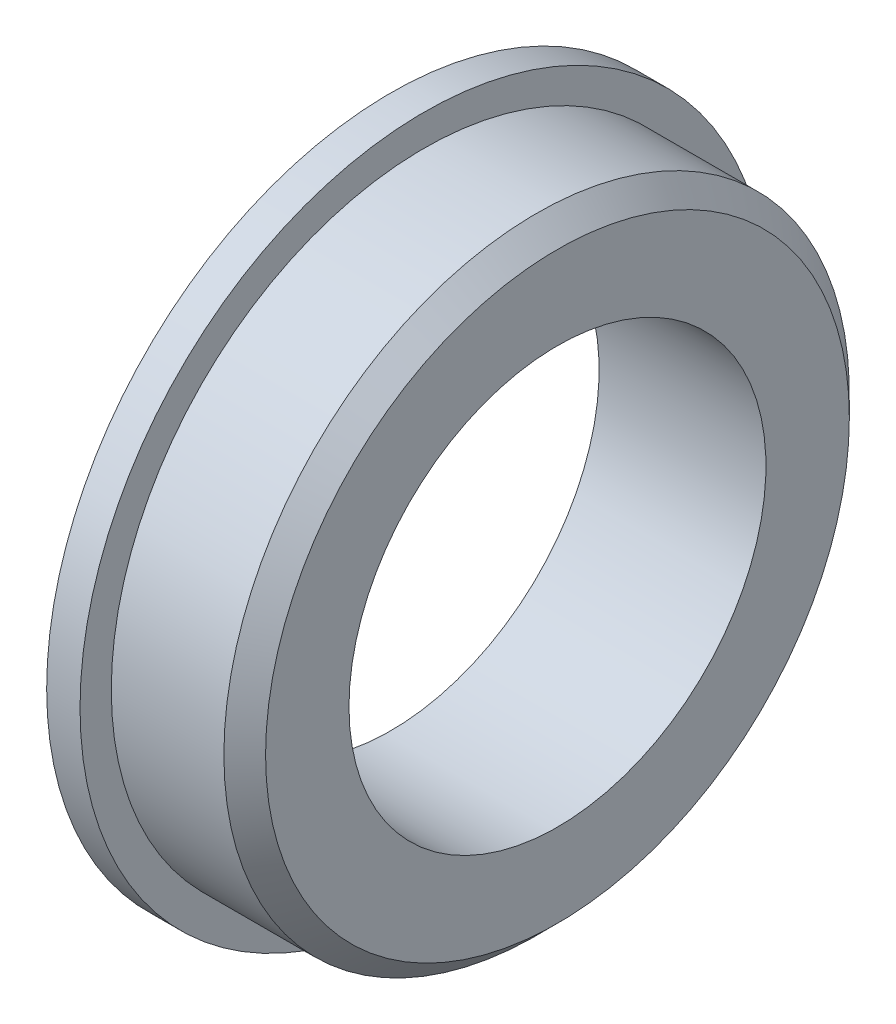
ISO-10303-21;
HEADER;
FILE_DESCRIPTION(('STEP AP214'),'2;1');
FILE_NAME('part.step','',(''),(''),'','','');
FILE_SCHEMA(('AUTOMOTIVE_DESIGN { 1 0 10303 214 1 1 1 1 }'));
ENDSEC;
DATA;
#1=APPLICATION_CONTEXT('core data for automotive mechanical design processes');
#2=APPLICATION_PROTOCOL_DEFINITION('international standard','automotive_design',2000,#1);
#3=PRODUCT_CONTEXT('',#1,'mechanical');
#4=PRODUCT('Part','Part','',(#3));
#5=PRODUCT_RELATED_PRODUCT_CATEGORY('part','',(#4));
#6=PRODUCT_DEFINITION_FORMATION('','',#4);
#7=PRODUCT_DEFINITION_CONTEXT('part definition',#1,'design');
#8=PRODUCT_DEFINITION('design','',#6,#7);
#9=PRODUCT_DEFINITION_SHAPE('','',#8);
#10=(LENGTH_UNIT() NAMED_UNIT(*) SI_UNIT(.MILLI.,.METRE.));
#11=(NAMED_UNIT(*) PLANE_ANGLE_UNIT() SI_UNIT($,.RADIAN.));
#12=(NAMED_UNIT(*) SI_UNIT($,.STERADIAN.) SOLID_ANGLE_UNIT());
#13=UNCERTAINTY_MEASURE_WITH_UNIT(LENGTH_MEASURE(1.E-05),#10,'distance_accuracy_value','');
#14=(GEOMETRIC_REPRESENTATION_CONTEXT(3) GLOBAL_UNCERTAINTY_ASSIGNED_CONTEXT((#13)) GLOBAL_UNIT_ASSIGNED_CONTEXT((#10,
#11,#12)) REPRESENTATION_CONTEXT('',''));
#15=CARTESIAN_POINT('',(0.,0.,0.));
#16=DIRECTION('',(0.,0.,1.));
#17=DIRECTION('',(1.,0.,0.));
#18=AXIS2_PLACEMENT_3D('',#15,#16,#17);
#19=CARTESIAN_POINT('',(3.50000000003092,0.,0.));
#20=DIRECTION('',(-1.,0.,0.));
#21=DIRECTION('',(0.,0.,1.));
#22=AXIS2_PLACEMENT_3D('',#19,#20,#21);
#23=CONICAL_SURFACE('',#22,7.49999999999318,0.785398163340605);
#24=CARTESIAN_POINT('',(3.49999999999999,0.,0.));
#25=DIRECTION('',(-1.,0.,0.));
#26=DIRECTION('',(0.,0.,1.));
#27=AXIS2_PLACEMENT_3D('',#24,#25,#26);
#28=CIRCLE('',#27,7.5);
#29=CARTESIAN_POINT('',(3.49999999999999,0.,7.5));
#30=VERTEX_POINT('',#29);
#31=EDGE_CURVE('E30',#30,#30,#28,.T.);
#32=ORIENTED_EDGE('',*,*,#31,.F.);
#33=EDGE_LOOP('',(#32));
#34=FACE_BOUND('',#33,.T.);
#35=CARTESIAN_POINT('',(3.99999999996226,0.,0.));
#36=DIRECTION('',(-1.,0.,0.));
#37=DIRECTION('',(0.,0.,1.));
#38=AXIS2_PLACEMENT_3D('',#35,#36,#37);
#39=CIRCLE('',#38,7.00000000011869);
#40=CARTESIAN_POINT('',(3.99999999996226,0.,7.00000000011869));
#41=VERTEX_POINT('',#40);
#42=EDGE_CURVE('E18',#41,#41,#39,.F.);
#43=ORIENTED_EDGE('',*,*,#42,.F.);
#44=EDGE_LOOP('',(#43));
#45=FACE_BOUND('',#44,.T.);
#46=ADVANCED_FACE('F15',(#34,#45),#23,.T.);
#47=CARTESIAN_POINT('',(4.,0.,0.));
#48=DIRECTION('',(-1.,0.,0.));
#49=DIRECTION('',(0.,0.,1.));
#50=AXIS2_PLACEMENT_3D('',#47,#48,#49);
#51=CYLINDRICAL_SURFACE('',#50,7.5);
#52=CARTESIAN_POINT('',(0.8,0.,0.));
#53=DIRECTION('',(-1.,0.,0.));
#54=DIRECTION('',(0.,0.,1.));
#55=AXIS2_PLACEMENT_3D('',#52,#53,#54);
#56=CIRCLE('',#55,7.5);
#57=CARTESIAN_POINT('',(0.8,0.,7.5));
#58=VERTEX_POINT('',#57);
#59=EDGE_CURVE('E36',#58,#58,#56,.F.);
#60=ORIENTED_EDGE('',*,*,#59,.T.);
#61=EDGE_LOOP('',(#60));
#62=FACE_BOUND('',#61,.T.);
#63=ORIENTED_EDGE('',*,*,#31,.T.);
#64=EDGE_LOOP('',(#63));
#65=FACE_BOUND('',#64,.T.);
#66=ADVANCED_FACE('F46',(#62,#65),#51,.T.);
#67=CARTESIAN_POINT('',(4.,0.,0.));
#68=DIRECTION('',(1.,0.,0.));
#69=DIRECTION('',(0.,0.,-1.));
#70=AXIS2_PLACEMENT_3D('',#67,#68,#69);
#71=PLANE('',#70);
#72=CARTESIAN_POINT('',(4.,0.,0.));
#73=DIRECTION('',(-1.,0.,0.));
#74=DIRECTION('',(0.,0.,1.));
#75=AXIS2_PLACEMENT_3D('',#72,#73,#74);
#76=CIRCLE('',#75,5.);
#77=CARTESIAN_POINT('',(4.,0.,5.));
#78=VERTEX_POINT('',#77);
#79=EDGE_CURVE('E34',#78,#78,#76,.T.);
#80=ORIENTED_EDGE('',*,*,#79,.T.);
#81=EDGE_LOOP('',(#80));
#82=FACE_BOUND('',#81,.T.);
#83=ORIENTED_EDGE('',*,*,#42,.T.);
#84=EDGE_LOOP('',(#83));
#85=FACE_BOUND('',#84,.T.);
#86=ADVANCED_FACE('F54',(#82,#85),#71,.T.);
#87=CARTESIAN_POINT('',(0.8,0.,0.));
#88=DIRECTION('',(-1.,0.,0.));
#89=DIRECTION('',(0.,0.,1.));
#90=AXIS2_PLACEMENT_3D('',#87,#88,#89);
#91=PLANE('',#90);
#92=CARTESIAN_POINT('',(0.8,0.,0.));
#93=DIRECTION('',(-1.,0.,0.));
#94=DIRECTION('',(0.,0.,1.));
#95=AXIS2_PLACEMENT_3D('',#92,#93,#94);
#96=CIRCLE('',#95,8.25);
#97=CARTESIAN_POINT('',(0.8,0.,8.25));
#98=VERTEX_POINT('',#97);
#99=EDGE_CURVE('E27',#98,#98,#96,.T.);
#100=ORIENTED_EDGE('',*,*,#99,.F.);
#101=EDGE_LOOP('',(#100));
#102=FACE_BOUND('',#101,.T.);
#103=ORIENTED_EDGE('',*,*,#59,.F.);
#104=EDGE_LOOP('',(#103));
#105=FACE_BOUND('',#104,.T.);
#106=ADVANCED_FACE('F69',(#102,#105),#91,.F.);
#107=CARTESIAN_POINT('',(4.,0.,0.));
#108=DIRECTION('',(-1.,0.,0.));
#109=DIRECTION('',(0.,0.,1.));
#110=AXIS2_PLACEMENT_3D('',#107,#108,#109);
#111=CYLINDRICAL_SURFACE('',#110,5.);
#112=CARTESIAN_POINT('',(0.,0.,0.));
#113=DIRECTION('',(-1.,0.,0.));
#114=DIRECTION('',(0.,0.,1.));
#115=AXIS2_PLACEMENT_3D('',#112,#113,#114);
#116=CIRCLE('',#115,5.);
#117=CARTESIAN_POINT('',(0.,0.,5.));
#118=VERTEX_POINT('',#117);
#119=EDGE_CURVE('E22',#118,#118,#116,.T.);
#120=ORIENTED_EDGE('',*,*,#119,.T.);
#121=EDGE_LOOP('',(#120));
#122=FACE_BOUND('',#121,.T.);
#123=ORIENTED_EDGE('',*,*,#79,.F.);
#124=EDGE_LOOP('',(#123));
#125=FACE_BOUND('',#124,.T.);
#126=ADVANCED_FACE('F63',(#122,#125),#111,.F.);
#127=CARTESIAN_POINT('',(0.8,0.,0.));
#128=DIRECTION('',(-1.,0.,0.));
#129=DIRECTION('',(0.,0.,1.));
#130=AXIS2_PLACEMENT_3D('',#127,#128,#129);
#131=CYLINDRICAL_SURFACE('',#130,8.25);
#132=CARTESIAN_POINT('',(0.,0.,0.));
#133=DIRECTION('',(-1.,0.,0.));
#134=DIRECTION('',(0.,0.,1.));
#135=AXIS2_PLACEMENT_3D('',#132,#133,#134);
#136=CIRCLE('',#135,8.25);
#137=CARTESIAN_POINT('',(0.,0.,8.25));
#138=VERTEX_POINT('',#137);
#139=EDGE_CURVE('E10',#138,#138,#136,.F.);
#140=ORIENTED_EDGE('',*,*,#139,.T.);
#141=EDGE_LOOP('',(#140));
#142=FACE_BOUND('',#141,.T.);
#143=ORIENTED_EDGE('',*,*,#99,.T.);
#144=EDGE_LOOP('',(#143));
#145=FACE_BOUND('',#144,.T.);
#146=ADVANCED_FACE('F57',(#142,#145),#131,.T.);
#147=CARTESIAN_POINT('',(0.,0.,0.));
#148=DIRECTION('',(1.,0.,0.));
#149=DIRECTION('',(0.,0.,-1.));
#150=AXIS2_PLACEMENT_3D('',#147,#148,#149);
#151=PLANE('',#150);
#152=ORIENTED_EDGE('',*,*,#139,.F.);
#153=EDGE_LOOP('',(#152));
#154=FACE_BOUND('',#153,.T.);
#155=ORIENTED_EDGE('',*,*,#119,.F.);
#156=EDGE_LOOP('',(#155));
#157=FACE_BOUND('',#156,.T.);
#158=ADVANCED_FACE('F55',(#154,#157),#151,.F.);
#159=CLOSED_SHELL('',(#46,#66,#86,#106,#126,#146,#158));
#160=MANIFOLD_SOLID_BREP('B1',#159);
#161=ADVANCED_BREP_SHAPE_REPRESENTATION('',(#18,#160),#14);
#162=SHAPE_DEFINITION_REPRESENTATION(#9,#161);
ENDSEC;
END-ISO-10303-21;
